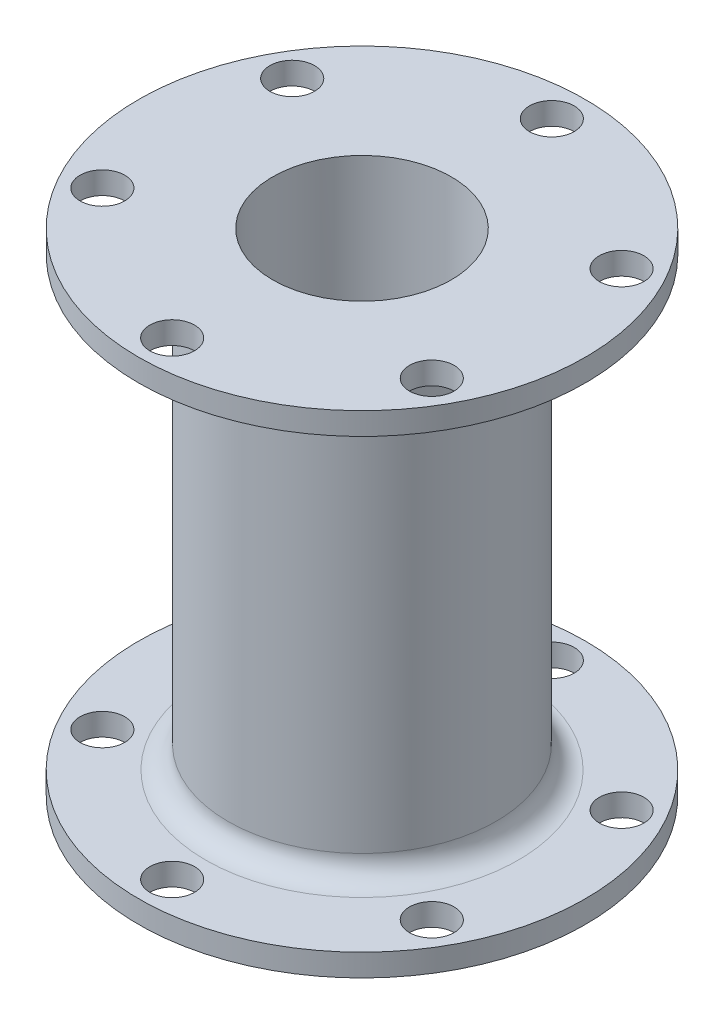
ISO-10303-21;
HEADER;
FILE_DESCRIPTION(('STEP AP214'),'2;1');
FILE_NAME('part.step','',(''),(''),'','','');
FILE_SCHEMA(('AUTOMOTIVE_DESIGN { 1 0 10303 214 1 1 1 1 }'));
ENDSEC;
DATA;
#1=APPLICATION_CONTEXT('core data for automotive mechanical design processes');
#2=APPLICATION_PROTOCOL_DEFINITION('international standard','automotive_design',2000,#1);
#3=PRODUCT_CONTEXT('',#1,'mechanical');
#4=PRODUCT('Part','Part','',(#3));
#5=PRODUCT_RELATED_PRODUCT_CATEGORY('part','',(#4));
#6=PRODUCT_DEFINITION_FORMATION('','',#4);
#7=PRODUCT_DEFINITION_CONTEXT('part definition',#1,'design');
#8=PRODUCT_DEFINITION('design','',#6,#7);
#9=PRODUCT_DEFINITION_SHAPE('','',#8);
#10=(LENGTH_UNIT() NAMED_UNIT(*) SI_UNIT(.MILLI.,.METRE.));
#11=(NAMED_UNIT(*) PLANE_ANGLE_UNIT() SI_UNIT($,.RADIAN.));
#12=(NAMED_UNIT(*) SI_UNIT($,.STERADIAN.) SOLID_ANGLE_UNIT());
#13=UNCERTAINTY_MEASURE_WITH_UNIT(LENGTH_MEASURE(1.E-05),#10,'distance_accuracy_value','');
#14=(GEOMETRIC_REPRESENTATION_CONTEXT(3) GLOBAL_UNCERTAINTY_ASSIGNED_CONTEXT((#13)) GLOBAL_UNIT_ASSIGNED_CONTEXT((#10,
#11,#12)) REPRESENTATION_CONTEXT('',''));
#15=CARTESIAN_POINT('',(0.,0.,0.));
#16=DIRECTION('',(0.,0.,1.));
#17=DIRECTION('',(1.,0.,0.));
#18=AXIS2_PLACEMENT_3D('',#15,#16,#17);
#19=CARTESIAN_POINT('',(0.,12.7,0.));
#20=DIRECTION('',(0.,-1.,0.));
#21=DIRECTION('',(0.,0.,-1.));
#22=AXIS2_PLACEMENT_3D('',#19,#20,#21);
#23=CYLINDRICAL_SURFACE('',#22,127.);
#24=CARTESIAN_POINT('',(0.,12.7,0.));
#25=DIRECTION('',(0.,1.,0.));
#26=DIRECTION('',(0.,0.,1.));
#27=AXIS2_PLACEMENT_3D('',#24,#25,#26);
#28=CIRCLE('',#27,127.);
#29=CARTESIAN_POINT('',(0.,12.7,127.));
#30=VERTEX_POINT('',#29);
#31=EDGE_CURVE('E51',#30,#30,#28,.T.);
#32=ORIENTED_EDGE('',*,*,#31,.F.);
#33=EDGE_LOOP('',(#32));
#34=FACE_BOUND('',#33,.T.);
#35=CARTESIAN_POINT('',(0.,0.,0.));
#36=DIRECTION('',(0.,1.,0.));
#37=DIRECTION('',(0.,0.,1.));
#38=AXIS2_PLACEMENT_3D('',#35,#36,#37);
#39=CIRCLE('',#38,127.);
#40=CARTESIAN_POINT('',(0.,0.,127.));
#41=VERTEX_POINT('',#40);
#42=EDGE_CURVE('E52',#41,#41,#39,.T.);
#43=ORIENTED_EDGE('',*,*,#42,.T.);
#44=EDGE_LOOP('',(#43));
#45=FACE_BOUND('',#44,.T.);
#46=ADVANCED_FACE('F31',(#34,#45),#23,.T.);
#47=CARTESIAN_POINT('',(0.,12.7,0.));
#48=DIRECTION('',(0.,1.,0.));
#49=DIRECTION('',(0.,0.,1.));
#50=AXIS2_PLACEMENT_3D('',#47,#48,#49);
#51=PLANE('',#50);
#52=CARTESIAN_POINT('',(0.,12.7,0.));
#53=DIRECTION('',(0.,1.,0.));
#54=DIRECTION('',(0.,0.,1.));
#55=AXIS2_PLACEMENT_3D('',#52,#53,#54);
#56=CIRCLE('',#55,50.8);
#57=CARTESIAN_POINT('',(0.,12.7,50.8));
#58=VERTEX_POINT('',#57);
#59=EDGE_CURVE('E135',#58,#58,#56,.T.);
#60=ORIENTED_EDGE('',*,*,#59,.F.);
#61=EDGE_LOOP('',(#60));
#62=FACE_BOUND('',#61,.T.);
#63=CARTESIAN_POINT('',(0.,12.7,-107.95));
#64=DIRECTION('',(0.,1.,0.));
#65=DIRECTION('',(0.,0.,1.));
#66=AXIS2_PLACEMENT_3D('',#63,#64,#65);
#67=CIRCLE('',#66,12.7);
#68=CARTESIAN_POINT('',(0.,12.7,-95.25));
#69=VERTEX_POINT('',#68);
#70=EDGE_CURVE('E83',#69,#69,#67,.T.);
#71=ORIENTED_EDGE('',*,*,#70,.F.);
#72=EDGE_LOOP('',(#71));
#73=FACE_BOUND('',#72,.T.);
#74=CARTESIAN_POINT('',(93.6625,12.7,53.975));
#75=DIRECTION('',(0.,1.,0.));
#76=DIRECTION('',(0.,0.,1.));
#77=AXIS2_PLACEMENT_3D('',#74,#75,#76);
#78=CIRCLE('',#77,12.7);
#79=CARTESIAN_POINT('',(93.6625,12.7,66.675));
#80=VERTEX_POINT('',#79);
#81=EDGE_CURVE('E84',#80,#80,#78,.T.);
#82=ORIENTED_EDGE('',*,*,#81,.F.);
#83=EDGE_LOOP('',(#82));
#84=FACE_BOUND('',#83,.T.);
#85=CARTESIAN_POINT('',(-93.6625,12.7,53.975));
#86=DIRECTION('',(0.,1.,0.));
#87=DIRECTION('',(0.,0.,1.));
#88=AXIS2_PLACEMENT_3D('',#85,#86,#87);
#89=CIRCLE('',#88,12.7);
#90=CARTESIAN_POINT('',(-93.6625,12.7,66.675));
#91=VERTEX_POINT('',#90);
#92=EDGE_CURVE('E58',#91,#91,#89,.T.);
#93=ORIENTED_EDGE('',*,*,#92,.F.);
#94=EDGE_LOOP('',(#93));
#95=FACE_BOUND('',#94,.T.);
#96=CARTESIAN_POINT('',(-93.6625,12.7,-53.975));
#97=DIRECTION('',(0.,1.,0.));
#98=DIRECTION('',(0.,0.,1.));
#99=AXIS2_PLACEMENT_3D('',#96,#97,#98);
#100=CIRCLE('',#99,12.7);
#101=CARTESIAN_POINT('',(-93.6625,12.7,-41.275));
#102=VERTEX_POINT('',#101);
#103=EDGE_CURVE('E65',#102,#102,#100,.T.);
#104=ORIENTED_EDGE('',*,*,#103,.F.);
#105=EDGE_LOOP('',(#104));
#106=FACE_BOUND('',#105,.T.);
#107=CARTESIAN_POINT('',(93.6625,12.7,-53.975));
#108=DIRECTION('',(0.,1.,0.));
#109=DIRECTION('',(0.,0.,1.));
#110=AXIS2_PLACEMENT_3D('',#107,#108,#109);
#111=CIRCLE('',#110,12.7);
#112=CARTESIAN_POINT('',(93.6625,12.7,-41.275));
#113=VERTEX_POINT('',#112);
#114=EDGE_CURVE('E71',#113,#113,#111,.T.);
#115=ORIENTED_EDGE('',*,*,#114,.F.);
#116=EDGE_LOOP('',(#115));
#117=FACE_BOUND('',#116,.T.);
#118=CARTESIAN_POINT('',(0.,12.7,107.95));
#119=DIRECTION('',(0.,1.,0.));
#120=DIRECTION('',(0.,0.,1.));
#121=AXIS2_PLACEMENT_3D('',#118,#119,#120);
#122=CIRCLE('',#121,12.7);
#123=CARTESIAN_POINT('',(0.,12.7,120.65));
#124=VERTEX_POINT('',#123);
#125=EDGE_CURVE('E77',#124,#124,#122,.T.);
#126=ORIENTED_EDGE('',*,*,#125,.F.);
#127=EDGE_LOOP('',(#126));
#128=FACE_BOUND('',#127,.T.);
#129=ORIENTED_EDGE('',*,*,#31,.T.);
#130=EDGE_LOOP('',(#129));
#131=FACE_BOUND('',#130,.T.);
#132=ADVANCED_FACE('F182',(#62,#73,#84,#95,#106,#117,#128,#131),#51,.T.);
#133=CARTESIAN_POINT('',(0.,0.,0.));
#134=DIRECTION('',(0.,1.,0.));
#135=DIRECTION('',(0.,0.,1.));
#136=AXIS2_PLACEMENT_3D('',#133,#134,#135);
#137=PLANE('',#136);
#138=CARTESIAN_POINT('',(0.,0.,0.));
#139=DIRECTION('',(0.,1.,0.));
#140=DIRECTION('',(0.,0.,1.));
#141=AXIS2_PLACEMENT_3D('',#138,#139,#140);
#142=CIRCLE('',#141,88.9);
#143=CARTESIAN_POINT('',(0.,0.,88.9));
#144=VERTEX_POINT('',#143);
#145=EDGE_CURVE('E10',#144,#144,#142,.T.);
#146=ORIENTED_EDGE('',*,*,#145,.T.);
#147=EDGE_LOOP('',(#146));
#148=FACE_BOUND('',#147,.T.);
#149=CARTESIAN_POINT('',(0.,0.,-107.95));
#150=DIRECTION('',(0.,1.,0.));
#151=DIRECTION('',(0.,0.,1.));
#152=AXIS2_PLACEMENT_3D('',#149,#150,#151);
#153=CIRCLE('',#152,12.7);
#154=CARTESIAN_POINT('',(0.,0.,-95.25));
#155=VERTEX_POINT('',#154);
#156=EDGE_CURVE('E55',#155,#155,#153,.T.);
#157=ORIENTED_EDGE('',*,*,#156,.T.);
#158=EDGE_LOOP('',(#157));
#159=FACE_BOUND('',#158,.T.);
#160=CARTESIAN_POINT('',(93.6625,0.,53.975));
#161=DIRECTION('',(0.,1.,0.));
#162=DIRECTION('',(0.,0.,1.));
#163=AXIS2_PLACEMENT_3D('',#160,#161,#162);
#164=CIRCLE('',#163,12.7);
#165=CARTESIAN_POINT('',(93.6625,0.,66.675));
#166=VERTEX_POINT('',#165);
#167=EDGE_CURVE('E62',#166,#166,#164,.T.);
#168=ORIENTED_EDGE('',*,*,#167,.T.);
#169=EDGE_LOOP('',(#168));
#170=FACE_BOUND('',#169,.T.);
#171=CARTESIAN_POINT('',(-93.6625,0.,53.975));
#172=DIRECTION('',(0.,1.,0.));
#173=DIRECTION('',(0.,0.,1.));
#174=AXIS2_PLACEMENT_3D('',#171,#172,#173);
#175=CIRCLE('',#174,12.7);
#176=CARTESIAN_POINT('',(-93.6625,0.,66.675));
#177=VERTEX_POINT('',#176);
#178=EDGE_CURVE('E61',#177,#177,#175,.T.);
#179=ORIENTED_EDGE('',*,*,#178,.T.);
#180=EDGE_LOOP('',(#179));
#181=FACE_BOUND('',#180,.T.);
#182=CARTESIAN_POINT('',(-93.6625,0.,-53.975));
#183=DIRECTION('',(0.,1.,0.));
#184=DIRECTION('',(0.,0.,1.));
#185=AXIS2_PLACEMENT_3D('',#182,#183,#184);
#186=CIRCLE('',#185,12.7);
#187=CARTESIAN_POINT('',(-93.6625,0.,-41.275));
#188=VERTEX_POINT('',#187);
#189=EDGE_CURVE('E68',#188,#188,#186,.T.);
#190=ORIENTED_EDGE('',*,*,#189,.T.);
#191=EDGE_LOOP('',(#190));
#192=FACE_BOUND('',#191,.T.);
#193=CARTESIAN_POINT('',(93.6625,0.,-53.975));
#194=DIRECTION('',(0.,1.,0.));
#195=DIRECTION('',(0.,0.,1.));
#196=AXIS2_PLACEMENT_3D('',#193,#194,#195);
#197=CIRCLE('',#196,12.7);
#198=CARTESIAN_POINT('',(93.6625,0.,-41.275));
#199=VERTEX_POINT('',#198);
#200=EDGE_CURVE('E74',#199,#199,#197,.T.);
#201=ORIENTED_EDGE('',*,*,#200,.T.);
#202=EDGE_LOOP('',(#201));
#203=FACE_BOUND('',#202,.T.);
#204=CARTESIAN_POINT('',(0.,0.,107.95));
#205=DIRECTION('',(0.,1.,0.));
#206=DIRECTION('',(0.,0.,1.));
#207=AXIS2_PLACEMENT_3D('',#204,#205,#206);
#208=CIRCLE('',#207,12.7);
#209=CARTESIAN_POINT('',(0.,0.,120.65));
#210=VERTEX_POINT('',#209);
#211=EDGE_CURVE('E80',#210,#210,#208,.T.);
#212=ORIENTED_EDGE('',*,*,#211,.T.);
#213=EDGE_LOOP('',(#212));
#214=FACE_BOUND('',#213,.T.);
#215=ORIENTED_EDGE('',*,*,#42,.F.);
#216=EDGE_LOOP('',(#215));
#217=FACE_BOUND('',#216,.T.);
#218=ADVANCED_FACE('F188',(#148,#159,#170,#181,#192,#203,#214,#217),#137,.F.);
#219=CARTESIAN_POINT('',(0.,0.,107.95));
#220=DIRECTION('',(0.,1.,0.));
#221=DIRECTION('',(0.,0.,1.));
#222=AXIS2_PLACEMENT_3D('',#219,#220,#221);
#223=CYLINDRICAL_SURFACE('',#222,12.7);
#224=ORIENTED_EDGE('',*,*,#211,.F.);
#225=EDGE_LOOP('',(#224));
#226=FACE_BOUND('',#225,.T.);
#227=ORIENTED_EDGE('',*,*,#125,.T.);
#228=EDGE_LOOP('',(#227));
#229=FACE_BOUND('',#228,.T.);
#230=ADVANCED_FACE('F227',(#226,#229),#223,.F.);
#231=CARTESIAN_POINT('',(93.6625,0.,-53.975));
#232=DIRECTION('',(0.,1.,0.));
#233=DIRECTION('',(0.,0.,1.));
#234=AXIS2_PLACEMENT_3D('',#231,#232,#233);
#235=CYLINDRICAL_SURFACE('',#234,12.7);
#236=ORIENTED_EDGE('',*,*,#200,.F.);
#237=EDGE_LOOP('',(#236));
#238=FACE_BOUND('',#237,.T.);
#239=ORIENTED_EDGE('',*,*,#114,.T.);
#240=EDGE_LOOP('',(#239));
#241=FACE_BOUND('',#240,.T.);
#242=ADVANCED_FACE('F230',(#238,#241),#235,.F.);
#243=CARTESIAN_POINT('',(-93.6625,0.,-53.975));
#244=DIRECTION('',(0.,1.,0.));
#245=DIRECTION('',(0.,0.,1.));
#246=AXIS2_PLACEMENT_3D('',#243,#244,#245);
#247=CYLINDRICAL_SURFACE('',#246,12.7);
#248=ORIENTED_EDGE('',*,*,#189,.F.);
#249=EDGE_LOOP('',(#248));
#250=FACE_BOUND('',#249,.T.);
#251=ORIENTED_EDGE('',*,*,#103,.T.);
#252=EDGE_LOOP('',(#251));
#253=FACE_BOUND('',#252,.T.);
#254=ADVANCED_FACE('F234',(#250,#253),#247,.F.);
#255=CARTESIAN_POINT('',(-93.6625,0.,53.975));
#256=DIRECTION('',(0.,1.,0.));
#257=DIRECTION('',(0.,0.,1.));
#258=AXIS2_PLACEMENT_3D('',#255,#256,#257);
#259=CYLINDRICAL_SURFACE('',#258,12.7);
#260=ORIENTED_EDGE('',*,*,#178,.F.);
#261=EDGE_LOOP('',(#260));
#262=FACE_BOUND('',#261,.T.);
#263=ORIENTED_EDGE('',*,*,#92,.T.);
#264=EDGE_LOOP('',(#263));
#265=FACE_BOUND('',#264,.T.);
#266=ADVANCED_FACE('F225',(#262,#265),#259,.F.);
#267=CARTESIAN_POINT('',(93.6625,0.,53.975));
#268=DIRECTION('',(0.,1.,0.));
#269=DIRECTION('',(0.,0.,1.));
#270=AXIS2_PLACEMENT_3D('',#267,#268,#269);
#271=CYLINDRICAL_SURFACE('',#270,12.7);
#272=ORIENTED_EDGE('',*,*,#167,.F.);
#273=EDGE_LOOP('',(#272));
#274=FACE_BOUND('',#273,.T.);
#275=ORIENTED_EDGE('',*,*,#81,.T.);
#276=EDGE_LOOP('',(#275));
#277=FACE_BOUND('',#276,.T.);
#278=ADVANCED_FACE('F219',(#274,#277),#271,.F.);
#279=CARTESIAN_POINT('',(0.,0.,-107.95));
#280=DIRECTION('',(0.,1.,0.));
#281=DIRECTION('',(0.,0.,1.));
#282=AXIS2_PLACEMENT_3D('',#279,#280,#281);
#283=CYLINDRICAL_SURFACE('',#282,12.7);
#284=ORIENTED_EDGE('',*,*,#156,.F.);
#285=EDGE_LOOP('',(#284));
#286=FACE_BOUND('',#285,.T.);
#287=ORIENTED_EDGE('',*,*,#70,.T.);
#288=EDGE_LOOP('',(#287));
#289=FACE_BOUND('',#288,.T.);
#290=ADVANCED_FACE('F212',(#286,#289),#283,.F.);
#291=CARTESIAN_POINT('',(0.,-254.,0.));
#292=DIRECTION('',(0.,1.,0.));
#293=DIRECTION('',(0.,0.,1.));
#294=AXIS2_PLACEMENT_3D('',#291,#292,#293);
#295=CYLINDRICAL_SURFACE('',#294,76.2);
#296=CARTESIAN_POINT('',(0.,-241.3,0.));
#297=DIRECTION('',(0.,-1.,0.));
#298=DIRECTION('',(0.,0.,-1.));
#299=AXIS2_PLACEMENT_3D('',#296,#297,#298);
#300=CIRCLE('',#299,76.2);
#301=CARTESIAN_POINT('',(0.,-241.3,-76.2));
#302=VERTEX_POINT('',#301);
#303=EDGE_CURVE('E39',#302,#302,#300,.F.);
#304=ORIENTED_EDGE('',*,*,#303,.T.);
#305=EDGE_LOOP('',(#304));
#306=FACE_BOUND('',#305,.T.);
#307=CARTESIAN_POINT('',(0.,-12.7,0.));
#308=DIRECTION('',(0.,1.,0.));
#309=DIRECTION('',(0.,0.,1.));
#310=AXIS2_PLACEMENT_3D('',#307,#308,#309);
#311=CIRCLE('',#310,76.2);
#312=CARTESIAN_POINT('',(0.,-12.7,76.2));
#313=VERTEX_POINT('',#312);
#314=EDGE_CURVE('E43',#313,#313,#311,.F.);
#315=ORIENTED_EDGE('',*,*,#314,.T.);
#316=EDGE_LOOP('',(#315));
#317=FACE_BOUND('',#316,.T.);
#318=ADVANCED_FACE('F166',(#306,#317),#295,.T.);
#319=CARTESIAN_POINT('',(0.,-266.7,0.));
#320=DIRECTION('',(0.,1.,0.));
#321=DIRECTION('',(0.,0.,1.));
#322=AXIS2_PLACEMENT_3D('',#319,#320,#321);
#323=CYLINDRICAL_SURFACE('',#322,127.);
#324=CARTESIAN_POINT('',(0.,-266.7,0.));
#325=DIRECTION('',(0.,-1.,0.));
#326=DIRECTION('',(0.,0.,-1.));
#327=AXIS2_PLACEMENT_3D('',#324,#325,#326);
#328=CIRCLE('',#327,127.);
#329=CARTESIAN_POINT('',(0.,-266.7,-127.));
#330=VERTEX_POINT('',#329);
#331=EDGE_CURVE('E87',#330,#330,#328,.T.);
#332=ORIENTED_EDGE('',*,*,#331,.F.);
#333=EDGE_LOOP('',(#332));
#334=FACE_BOUND('',#333,.T.);
#335=CARTESIAN_POINT('',(0.,-254.,0.));
#336=DIRECTION('',(0.,-1.,0.));
#337=DIRECTION('',(0.,0.,-1.));
#338=AXIS2_PLACEMENT_3D('',#335,#336,#337);
#339=CIRCLE('',#338,127.);
#340=CARTESIAN_POINT('',(0.,-254.,-127.));
#341=VERTEX_POINT('',#340);
#342=EDGE_CURVE('E94',#341,#341,#339,.T.);
#343=ORIENTED_EDGE('',*,*,#342,.T.);
#344=EDGE_LOOP('',(#343));
#345=FACE_BOUND('',#344,.T.);
#346=ADVANCED_FACE('F148',(#334,#345),#323,.T.);
#347=CARTESIAN_POINT('',(0.,-266.7,0.));
#348=DIRECTION('',(0.,-1.,0.));
#349=DIRECTION('',(0.,0.,-1.));
#350=AXIS2_PLACEMENT_3D('',#347,#348,#349);
#351=PLANE('',#350);
#352=CARTESIAN_POINT('',(0.,-266.7,0.));
#353=DIRECTION('',(0.,-1.,0.));
#354=DIRECTION('',(0.,0.,-1.));
#355=AXIS2_PLACEMENT_3D('',#352,#353,#354);
#356=CIRCLE('',#355,50.8);
#357=CARTESIAN_POINT('',(0.,-266.7,-50.8));
#358=VERTEX_POINT('',#357);
#359=EDGE_CURVE('E35',#358,#358,#356,.T.);
#360=ORIENTED_EDGE('',*,*,#359,.F.);
#361=EDGE_LOOP('',(#360));
#362=FACE_BOUND('',#361,.T.);
#363=CARTESIAN_POINT('',(0.,-266.7,107.95));
#364=DIRECTION('',(0.,-1.,0.));
#365=DIRECTION('',(0.,0.,-1.));
#366=AXIS2_PLACEMENT_3D('',#363,#364,#365);
#367=CIRCLE('',#366,12.7);
#368=CARTESIAN_POINT('',(0.,-266.7,95.25));
#369=VERTEX_POINT('',#368);
#370=EDGE_CURVE('E113',#369,#369,#367,.T.);
#371=ORIENTED_EDGE('',*,*,#370,.F.);
#372=EDGE_LOOP('',(#371));
#373=FACE_BOUND('',#372,.T.);
#374=CARTESIAN_POINT('',(93.6625,-266.7,-53.975));
#375=DIRECTION('',(0.,-1.,0.));
#376=DIRECTION('',(0.,0.,-1.));
#377=AXIS2_PLACEMENT_3D('',#374,#375,#376);
#378=CIRCLE('',#377,12.7);
#379=CARTESIAN_POINT('',(93.6625,-266.7,-66.675));
#380=VERTEX_POINT('',#379);
#381=EDGE_CURVE('E126',#380,#380,#378,.T.);
#382=ORIENTED_EDGE('',*,*,#381,.F.);
#383=EDGE_LOOP('',(#382));
#384=FACE_BOUND('',#383,.T.);
#385=CARTESIAN_POINT('',(0.,-266.7,-107.95));
#386=DIRECTION('',(0.,-1.,0.));
#387=DIRECTION('',(0.,0.,-1.));
#388=AXIS2_PLACEMENT_3D('',#385,#386,#387);
#389=CIRCLE('',#388,12.7);
#390=CARTESIAN_POINT('',(0.,-266.7,-120.65));
#391=VERTEX_POINT('',#390);
#392=EDGE_CURVE('E107',#391,#391,#389,.T.);
#393=ORIENTED_EDGE('',*,*,#392,.F.);
#394=EDGE_LOOP('',(#393));
#395=FACE_BOUND('',#394,.T.);
#396=CARTESIAN_POINT('',(-93.6625,-266.7,53.975));
#397=DIRECTION('',(0.,-1.,0.));
#398=DIRECTION('',(0.,0.,-1.));
#399=AXIS2_PLACEMENT_3D('',#396,#397,#398);
#400=CIRCLE('',#399,12.7);
#401=CARTESIAN_POINT('',(-93.6625,-266.7,41.275));
#402=VERTEX_POINT('',#401);
#403=EDGE_CURVE('E100',#402,#402,#400,.T.);
#404=ORIENTED_EDGE('',*,*,#403,.F.);
#405=EDGE_LOOP('',(#404));
#406=FACE_BOUND('',#405,.T.);
#407=CARTESIAN_POINT('',(-93.6625,-266.7,-53.975));
#408=DIRECTION('',(0.,-1.,0.));
#409=DIRECTION('',(0.,0.,-1.));
#410=AXIS2_PLACEMENT_3D('',#407,#408,#409);
#411=CIRCLE('',#410,12.7);
#412=CARTESIAN_POINT('',(-93.6625,-266.7,-66.675));
#413=VERTEX_POINT('',#412);
#414=EDGE_CURVE('E121',#413,#413,#411,.T.);
#415=ORIENTED_EDGE('',*,*,#414,.F.);
#416=EDGE_LOOP('',(#415));
#417=FACE_BOUND('',#416,.T.);
#418=CARTESIAN_POINT('',(93.6625,-266.7,53.975));
#419=DIRECTION('',(0.,-1.,0.));
#420=DIRECTION('',(0.,0.,-1.));
#421=AXIS2_PLACEMENT_3D('',#418,#419,#420);
#422=CIRCLE('',#421,12.7);
#423=CARTESIAN_POINT('',(93.6625,-266.7,41.275));
#424=VERTEX_POINT('',#423);
#425=EDGE_CURVE('E114',#424,#424,#422,.T.);
#426=ORIENTED_EDGE('',*,*,#425,.F.);
#427=EDGE_LOOP('',(#426));
#428=FACE_BOUND('',#427,.T.);
#429=ORIENTED_EDGE('',*,*,#331,.T.);
#430=EDGE_LOOP('',(#429));
#431=FACE_BOUND('',#430,.T.);
#432=ADVANCED_FACE('F144',(#362,#373,#384,#395,#406,#417,#428,#431),#351,.T.);
#433=CARTESIAN_POINT('',(0.,-254.,0.));
#434=DIRECTION('',(0.,-1.,0.));
#435=DIRECTION('',(0.,0.,-1.));
#436=AXIS2_PLACEMENT_3D('',#433,#434,#435);
#437=PLANE('',#436);
#438=CARTESIAN_POINT('',(0.,-254.,0.));
#439=DIRECTION('',(0.,-1.,0.));
#440=DIRECTION('',(0.,0.,-1.));
#441=AXIS2_PLACEMENT_3D('',#438,#439,#440);
#442=CIRCLE('',#441,88.9);
#443=CARTESIAN_POINT('',(0.,-254.,-88.9));
#444=VERTEX_POINT('',#443);
#445=EDGE_CURVE('E48',#444,#444,#442,.T.);
#446=ORIENTED_EDGE('',*,*,#445,.T.);
#447=EDGE_LOOP('',(#446));
#448=FACE_BOUND('',#447,.T.);
#449=CARTESIAN_POINT('',(0.,-254.,107.95));
#450=DIRECTION('',(0.,-1.,0.));
#451=DIRECTION('',(0.,0.,-1.));
#452=AXIS2_PLACEMENT_3D('',#449,#450,#451);
#453=CIRCLE('',#452,12.7);
#454=CARTESIAN_POINT('',(0.,-254.,95.25));
#455=VERTEX_POINT('',#454);
#456=EDGE_CURVE('E97',#455,#455,#453,.T.);
#457=ORIENTED_EDGE('',*,*,#456,.T.);
#458=EDGE_LOOP('',(#457));
#459=FACE_BOUND('',#458,.T.);
#460=CARTESIAN_POINT('',(93.6625,-254.,-53.975));
#461=DIRECTION('',(0.,-1.,0.));
#462=DIRECTION('',(0.,0.,-1.));
#463=AXIS2_PLACEMENT_3D('',#460,#461,#462);
#464=CIRCLE('',#463,12.7);
#465=CARTESIAN_POINT('',(93.6625,-254.,-66.675));
#466=VERTEX_POINT('',#465);
#467=EDGE_CURVE('E118',#466,#466,#464,.T.);
#468=ORIENTED_EDGE('',*,*,#467,.T.);
#469=EDGE_LOOP('',(#468));
#470=FACE_BOUND('',#469,.T.);
#471=CARTESIAN_POINT('',(0.,-254.,-107.95));
#472=DIRECTION('',(0.,-1.,0.));
#473=DIRECTION('',(0.,0.,-1.));
#474=AXIS2_PLACEMENT_3D('',#471,#472,#473);
#475=CIRCLE('',#474,12.7);
#476=CARTESIAN_POINT('',(0.,-254.,-120.65));
#477=VERTEX_POINT('',#476);
#478=EDGE_CURVE('E110',#477,#477,#475,.T.);
#479=ORIENTED_EDGE('',*,*,#478,.T.);
#480=EDGE_LOOP('',(#479));
#481=FACE_BOUND('',#480,.T.);
#482=CARTESIAN_POINT('',(-93.6625,-254.,53.975));
#483=DIRECTION('',(0.,-1.,0.));
#484=DIRECTION('',(0.,0.,-1.));
#485=AXIS2_PLACEMENT_3D('',#482,#483,#484);
#486=CIRCLE('',#485,12.7);
#487=CARTESIAN_POINT('',(-93.6625,-254.,41.275));
#488=VERTEX_POINT('',#487);
#489=EDGE_CURVE('E103',#488,#488,#486,.T.);
#490=ORIENTED_EDGE('',*,*,#489,.T.);
#491=EDGE_LOOP('',(#490));
#492=FACE_BOUND('',#491,.T.);
#493=CARTESIAN_POINT('',(-93.6625,-254.,-53.975));
#494=DIRECTION('',(0.,-1.,0.));
#495=DIRECTION('',(0.,0.,-1.));
#496=AXIS2_PLACEMENT_3D('',#493,#494,#495);
#497=CIRCLE('',#496,12.7);
#498=CARTESIAN_POINT('',(-93.6625,-254.,-66.675));
#499=VERTEX_POINT('',#498);
#500=EDGE_CURVE('E104',#499,#499,#497,.T.);
#501=ORIENTED_EDGE('',*,*,#500,.T.);
#502=EDGE_LOOP('',(#501));
#503=FACE_BOUND('',#502,.T.);
#504=CARTESIAN_POINT('',(93.6625,-254.,53.975));
#505=DIRECTION('',(0.,-1.,0.));
#506=DIRECTION('',(0.,0.,-1.));
#507=AXIS2_PLACEMENT_3D('',#504,#505,#506);
#508=CIRCLE('',#507,12.7);
#509=CARTESIAN_POINT('',(93.6625,-254.,41.275));
#510=VERTEX_POINT('',#509);
#511=EDGE_CURVE('E117',#510,#510,#508,.T.);
#512=ORIENTED_EDGE('',*,*,#511,.T.);
#513=EDGE_LOOP('',(#512));
#514=FACE_BOUND('',#513,.T.);
#515=ORIENTED_EDGE('',*,*,#342,.F.);
#516=EDGE_LOOP('',(#515));
#517=FACE_BOUND('',#516,.T.);
#518=ADVANCED_FACE('F147',(#448,#459,#470,#481,#492,#503,#514,#517),#437,.F.);
#519=CARTESIAN_POINT('',(93.6625,-254.,53.975));
#520=DIRECTION('',(0.,-1.,0.));
#521=DIRECTION('',(0.,0.,-1.));
#522=AXIS2_PLACEMENT_3D('',#519,#520,#521);
#523=CYLINDRICAL_SURFACE('',#522,12.7);
#524=ORIENTED_EDGE('',*,*,#511,.F.);
#525=EDGE_LOOP('',(#524));
#526=FACE_BOUND('',#525,.T.);
#527=ORIENTED_EDGE('',*,*,#425,.T.);
#528=EDGE_LOOP('',(#527));
#529=FACE_BOUND('',#528,.T.);
#530=ADVANCED_FACE('F171',(#526,#529),#523,.F.);
#531=CARTESIAN_POINT('',(-93.6625,-254.,-53.975));
#532=DIRECTION('',(0.,-1.,0.));
#533=DIRECTION('',(0.,0.,-1.));
#534=AXIS2_PLACEMENT_3D('',#531,#532,#533);
#535=CYLINDRICAL_SURFACE('',#534,12.7);
#536=ORIENTED_EDGE('',*,*,#500,.F.);
#537=EDGE_LOOP('',(#536));
#538=FACE_BOUND('',#537,.T.);
#539=ORIENTED_EDGE('',*,*,#414,.T.);
#540=EDGE_LOOP('',(#539));
#541=FACE_BOUND('',#540,.T.);
#542=ADVANCED_FACE('F177',(#538,#541),#535,.F.);
#543=CARTESIAN_POINT('',(-93.6625,-254.,53.975));
#544=DIRECTION('',(0.,-1.,0.));
#545=DIRECTION('',(0.,0.,-1.));
#546=AXIS2_PLACEMENT_3D('',#543,#544,#545);
#547=CYLINDRICAL_SURFACE('',#546,12.7);
#548=ORIENTED_EDGE('',*,*,#489,.F.);
#549=EDGE_LOOP('',(#548));
#550=FACE_BOUND('',#549,.T.);
#551=ORIENTED_EDGE('',*,*,#403,.T.);
#552=EDGE_LOOP('',(#551));
#553=FACE_BOUND('',#552,.T.);
#554=ADVANCED_FACE('F334',(#550,#553),#547,.F.);
#555=CARTESIAN_POINT('',(0.,-254.,-107.95));
#556=DIRECTION('',(0.,-1.,0.));
#557=DIRECTION('',(0.,0.,-1.));
#558=AXIS2_PLACEMENT_3D('',#555,#556,#557);
#559=CYLINDRICAL_SURFACE('',#558,12.7);
#560=ORIENTED_EDGE('',*,*,#478,.F.);
#561=EDGE_LOOP('',(#560));
#562=FACE_BOUND('',#561,.T.);
#563=ORIENTED_EDGE('',*,*,#392,.T.);
#564=EDGE_LOOP('',(#563));
#565=FACE_BOUND('',#564,.T.);
#566=ADVANCED_FACE('F344',(#562,#565),#559,.F.);
#567=CARTESIAN_POINT('',(93.6625,-254.,-53.975));
#568=DIRECTION('',(0.,-1.,0.));
#569=DIRECTION('',(0.,0.,-1.));
#570=AXIS2_PLACEMENT_3D('',#567,#568,#569);
#571=CYLINDRICAL_SURFACE('',#570,12.7);
#572=ORIENTED_EDGE('',*,*,#467,.F.);
#573=EDGE_LOOP('',(#572));
#574=FACE_BOUND('',#573,.T.);
#575=ORIENTED_EDGE('',*,*,#381,.T.);
#576=EDGE_LOOP('',(#575));
#577=FACE_BOUND('',#576,.T.);
#578=ADVANCED_FACE('F203',(#574,#577),#571,.F.);
#579=CARTESIAN_POINT('',(0.,-254.,107.95));
#580=DIRECTION('',(0.,-1.,0.));
#581=DIRECTION('',(0.,0.,-1.));
#582=AXIS2_PLACEMENT_3D('',#579,#580,#581);
#583=CYLINDRICAL_SURFACE('',#582,12.7);
#584=ORIENTED_EDGE('',*,*,#456,.F.);
#585=EDGE_LOOP('',(#584));
#586=FACE_BOUND('',#585,.T.);
#587=ORIENTED_EDGE('',*,*,#370,.T.);
#588=EDGE_LOOP('',(#587));
#589=FACE_BOUND('',#588,.T.);
#590=ADVANCED_FACE('F196',(#586,#589),#583,.F.);
#591=CARTESIAN_POINT('',(0.,-241.3,0.));
#592=DIRECTION('',(0.,-1.,0.));
#593=DIRECTION('',(0.,0.,-1.));
#594=AXIS2_PLACEMENT_3D('',#591,#592,#593);
#595=TOROIDAL_SURFACE('',#594,88.9,12.7);
#596=ORIENTED_EDGE('',*,*,#303,.F.);
#597=EDGE_LOOP('',(#596));
#598=FACE_BOUND('',#597,.T.);
#599=ORIENTED_EDGE('',*,*,#445,.F.);
#600=EDGE_LOOP('',(#599));
#601=FACE_BOUND('',#600,.T.);
#602=ADVANCED_FACE('F194',(#598,#601),#595,.F.);
#603=CARTESIAN_POINT('',(0.,-12.7,0.));
#604=DIRECTION('',(0.,1.,0.));
#605=DIRECTION('',(0.,0.,1.));
#606=AXIS2_PLACEMENT_3D('',#603,#604,#605);
#607=TOROIDAL_SURFACE('',#606,88.9,12.7);
#608=ORIENTED_EDGE('',*,*,#145,.F.);
#609=EDGE_LOOP('',(#608));
#610=FACE_BOUND('',#609,.T.);
#611=ORIENTED_EDGE('',*,*,#314,.F.);
#612=EDGE_LOOP('',(#611));
#613=FACE_BOUND('',#612,.T.);
#614=ADVANCED_FACE('F33',(#610,#613),#607,.F.);
#615=CARTESIAN_POINT('',(0.,-1384.3,0.));
#616=DIRECTION('',(0.,1.,0.));
#617=DIRECTION('',(0.,0.,1.));
#618=AXIS2_PLACEMENT_3D('',#615,#616,#617);
#619=CYLINDRICAL_SURFACE('',#618,50.8);
#620=ORIENTED_EDGE('',*,*,#359,.T.);
#621=EDGE_LOOP('',(#620));
#622=FACE_BOUND('',#621,.T.);
#623=ORIENTED_EDGE('',*,*,#59,.T.);
#624=EDGE_LOOP('',(#623));
#625=FACE_BOUND('',#624,.T.);
#626=ADVANCED_FACE('F142',(#622,#625),#619,.F.);
#627=CLOSED_SHELL('',(#46,#132,#218,#230,#242,#254,#266,#278,#290,#318,#346,#432,#518,#530,#542,
#554,#566,#578,#590,#602,#614,#626));
#628=MANIFOLD_SOLID_BREP('B2',#627);
#629=ADVANCED_BREP_SHAPE_REPRESENTATION('',(#18,#628),#14);
#630=SHAPE_DEFINITION_REPRESENTATION(#9,#629);
ENDSEC;
END-ISO-10303-21;
